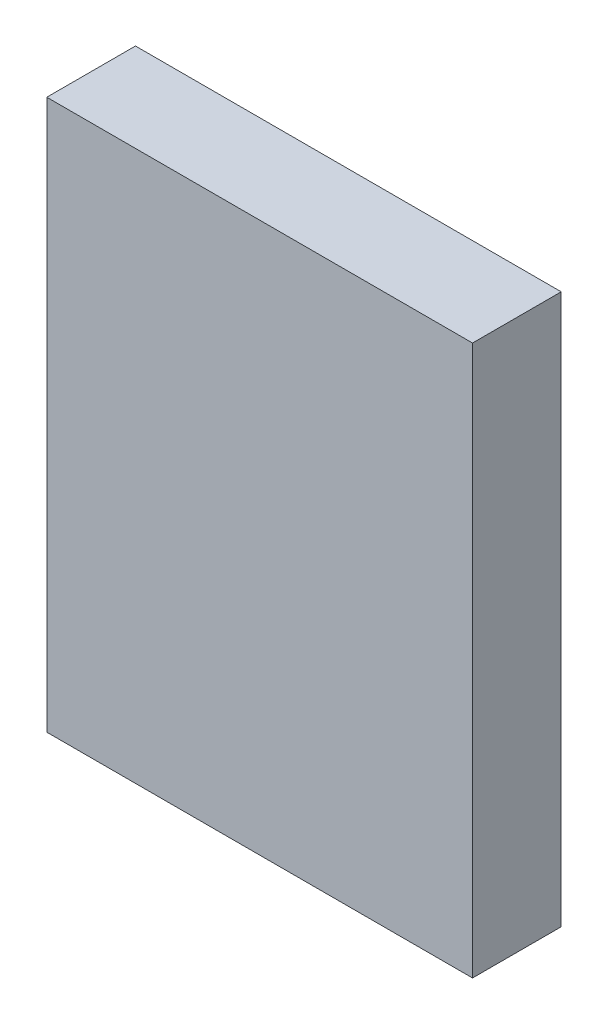
ISO-10303-21;
HEADER;
FILE_DESCRIPTION(('STEP AP214'),'2;1');
FILE_NAME('part.step','',(''),(''),'','','');
FILE_SCHEMA(('AUTOMOTIVE_DESIGN { 1 0 10303 214 1 1 1 1 }'));
ENDSEC;
DATA;
#1=APPLICATION_CONTEXT('core data for automotive mechanical design processes');
#2=APPLICATION_PROTOCOL_DEFINITION('international standard','automotive_design',2000,#1);
#3=PRODUCT_CONTEXT('',#1,'mechanical');
#4=PRODUCT('Part','Part','',(#3));
#5=PRODUCT_RELATED_PRODUCT_CATEGORY('part','',(#4));
#6=PRODUCT_DEFINITION_FORMATION('','',#4);
#7=PRODUCT_DEFINITION_CONTEXT('part definition',#1,'design');
#8=PRODUCT_DEFINITION('design','',#6,#7);
#9=PRODUCT_DEFINITION_SHAPE('','',#8);
#10=(LENGTH_UNIT() NAMED_UNIT(*) SI_UNIT(.MILLI.,.METRE.));
#11=(NAMED_UNIT(*) PLANE_ANGLE_UNIT() SI_UNIT($,.RADIAN.));
#12=(NAMED_UNIT(*) SI_UNIT($,.STERADIAN.) SOLID_ANGLE_UNIT());
#13=UNCERTAINTY_MEASURE_WITH_UNIT(LENGTH_MEASURE(1.E-05),#10,'distance_accuracy_value','');
#14=(GEOMETRIC_REPRESENTATION_CONTEXT(3) GLOBAL_UNCERTAINTY_ASSIGNED_CONTEXT((#13)) GLOBAL_UNIT_ASSIGNED_CONTEXT((#10,
#11,#12)) REPRESENTATION_CONTEXT('',''));
#15=CARTESIAN_POINT('',(0.,0.,0.));
#16=DIRECTION('',(0.,0.,1.));
#17=DIRECTION('',(1.,0.,0.));
#18=AXIS2_PLACEMENT_3D('',#15,#16,#17);
#19=CARTESIAN_POINT('',(-1.20000014,1.54999944,0.499999));
#20=DIRECTION('',(0.,0.,-1.));
#21=DIRECTION('',(-1.,0.,0.));
#22=AXIS2_PLACEMENT_3D('',#19,#20,#21);
#23=PLANE('',#22);
#24=DIRECTION('',(0.,1.,0.));
#25=VECTOR('',#24,1.);
#26=CARTESIAN_POINT('',(1.20000014,-1.54999944,0.499999));
#27=LINE('',#26,#25);
#28=CARTESIAN_POINT('',(1.20000014,-1.54999944,0.499999));
#29=VERTEX_POINT('',#28);
#30=CARTESIAN_POINT('',(1.20000014,1.54999944,0.499999));
#31=VERTEX_POINT('',#30);
#32=EDGE_CURVE('E80',#29,#31,#27,.T.);
#33=ORIENTED_EDGE('',*,*,#32,.T.);
#34=DIRECTION('',(1.,0.,0.));
#35=VECTOR('',#34,1.);
#36=CARTESIAN_POINT('',(1.20000014,1.54999944,0.499999));
#37=LINE('',#36,#35);
#38=CARTESIAN_POINT('',(-1.20000014,1.54999944,0.499999));
#39=VERTEX_POINT('',#38);
#40=EDGE_CURVE('E55',#31,#39,#37,.F.);
#41=ORIENTED_EDGE('',*,*,#40,.T.);
#42=DIRECTION('',(0.,1.,0.));
#43=VECTOR('',#42,1.);
#44=CARTESIAN_POINT('',(-1.20000014,1.54999944,0.499999));
#45=LINE('',#44,#43);
#46=CARTESIAN_POINT('',(-1.20000014,-1.54999944,0.499999));
#47=VERTEX_POINT('',#46);
#48=EDGE_CURVE('E57',#39,#47,#45,.F.);
#49=ORIENTED_EDGE('',*,*,#48,.T.);
#50=DIRECTION('',(1.,0.,0.));
#51=VECTOR('',#50,1.);
#52=CARTESIAN_POINT('',(-1.20000014,-1.54999944,0.499999));
#53=LINE('',#52,#51);
#54=EDGE_CURVE('E20',#47,#29,#53,.T.);
#55=ORIENTED_EDGE('',*,*,#54,.T.);
#56=EDGE_LOOP('',(#33,#41,#49,#55));
#57=FACE_BOUND('',#56,.T.);
#58=ADVANCED_FACE('F17',(#57),#23,.F.);
#59=CARTESIAN_POINT('',(-1.20000014,-1.54999944,0.));
#60=DIRECTION('',(0.,1.,0.));
#61=DIRECTION('',(0.,0.,1.));
#62=AXIS2_PLACEMENT_3D('',#59,#60,#61);
#63=PLANE('',#62);
#64=ORIENTED_EDGE('',*,*,#54,.F.);
#65=DIRECTION('',(0.,0.,-1.));
#66=VECTOR('',#65,1.);
#67=CARTESIAN_POINT('',(-1.20000014,-1.54999944,0.));
#68=LINE('',#67,#66);
#69=CARTESIAN_POINT('',(-1.20000014,-1.54999944,0.));
#70=VERTEX_POINT('',#69);
#71=EDGE_CURVE('E63',#47,#70,#68,.T.);
#72=ORIENTED_EDGE('',*,*,#71,.T.);
#73=DIRECTION('',(-1.,0.,0.));
#74=VECTOR('',#73,1.);
#75=CARTESIAN_POINT('',(-1.20000014,-1.54999944,0.));
#76=LINE('',#75,#74);
#77=CARTESIAN_POINT('',(1.20000014,-1.54999944,0.));
#78=VERTEX_POINT('',#77);
#79=EDGE_CURVE('E83',#78,#70,#76,.T.);
#80=ORIENTED_EDGE('',*,*,#79,.F.);
#81=DIRECTION('',(0.,0.,1.));
#82=VECTOR('',#81,1.);
#83=CARTESIAN_POINT('',(1.20000014,-1.54999944,0.));
#84=LINE('',#83,#82);
#85=EDGE_CURVE('E68',#78,#29,#84,.T.);
#86=ORIENTED_EDGE('',*,*,#85,.T.);
#87=EDGE_LOOP('',(#64,#72,#80,#86));
#88=FACE_BOUND('',#87,.T.);
#89=ADVANCED_FACE('F65',(#88),#63,.F.);
#90=CARTESIAN_POINT('',(-1.20000014,1.54999944,0.));
#91=DIRECTION('',(1.,0.,0.));
#92=DIRECTION('',(0.,0.,-1.));
#93=AXIS2_PLACEMENT_3D('',#90,#91,#92);
#94=PLANE('',#93);
#95=ORIENTED_EDGE('',*,*,#48,.F.);
#96=DIRECTION('',(0.,0.,-1.));
#97=VECTOR('',#96,1.);
#98=CARTESIAN_POINT('',(-1.20000014,1.54999944,0.));
#99=LINE('',#98,#97);
#100=CARTESIAN_POINT('',(-1.20000014,1.54999944,0.));
#101=VERTEX_POINT('',#100);
#102=EDGE_CURVE('E75',#39,#101,#99,.T.);
#103=ORIENTED_EDGE('',*,*,#102,.T.);
#104=DIRECTION('',(0.,1.,0.));
#105=VECTOR('',#104,1.);
#106=CARTESIAN_POINT('',(-1.20000014,1.54999944,0.));
#107=LINE('',#106,#105);
#108=EDGE_CURVE('E72',#70,#101,#107,.T.);
#109=ORIENTED_EDGE('',*,*,#108,.F.);
#110=ORIENTED_EDGE('',*,*,#71,.F.);
#111=EDGE_LOOP('',(#95,#103,#109,#110));
#112=FACE_BOUND('',#111,.T.);
#113=ADVANCED_FACE('F70',(#112),#94,.F.);
#114=CARTESIAN_POINT('',(1.20000014,1.54999944,0.));
#115=DIRECTION('',(0.,-1.,0.));
#116=DIRECTION('',(0.,0.,-1.));
#117=AXIS2_PLACEMENT_3D('',#114,#115,#116);
#118=PLANE('',#117);
#119=ORIENTED_EDGE('',*,*,#40,.F.);
#120=DIRECTION('',(0.,0.,1.));
#121=VECTOR('',#120,1.);
#122=CARTESIAN_POINT('',(1.20000014,1.54999944,0.));
#123=LINE('',#122,#121);
#124=CARTESIAN_POINT('',(1.20000014,1.54999944,0.));
#125=VERTEX_POINT('',#124);
#126=EDGE_CURVE('E35',#31,#125,#123,.F.);
#127=ORIENTED_EDGE('',*,*,#126,.T.);
#128=DIRECTION('',(-1.,0.,0.));
#129=VECTOR('',#128,1.);
#130=CARTESIAN_POINT('',(-1.20000014,1.54999944,0.));
#131=LINE('',#130,#129);
#132=EDGE_CURVE('E26',#101,#125,#131,.F.);
#133=ORIENTED_EDGE('',*,*,#132,.F.);
#134=ORIENTED_EDGE('',*,*,#102,.F.);
#135=EDGE_LOOP('',(#119,#127,#133,#134));
#136=FACE_BOUND('',#135,.T.);
#137=ADVANCED_FACE('F89',(#136),#118,.F.);
#138=CARTESIAN_POINT('',(1.20000014,-1.54999944,0.));
#139=DIRECTION('',(-1.,0.,0.));
#140=DIRECTION('',(0.,0.,1.));
#141=AXIS2_PLACEMENT_3D('',#138,#139,#140);
#142=PLANE('',#141);
#143=ORIENTED_EDGE('',*,*,#32,.F.);
#144=ORIENTED_EDGE('',*,*,#85,.F.);
#145=DIRECTION('',(0.,1.,0.));
#146=VECTOR('',#145,1.);
#147=CARTESIAN_POINT('',(1.20000014,1.54999944,0.));
#148=LINE('',#147,#146);
#149=EDGE_CURVE('E11',#125,#78,#148,.F.);
#150=ORIENTED_EDGE('',*,*,#149,.F.);
#151=ORIENTED_EDGE('',*,*,#126,.F.);
#152=EDGE_LOOP('',(#143,#144,#150,#151));
#153=FACE_BOUND('',#152,.T.);
#154=ADVANCED_FACE('F91',(#153),#142,.F.);
#155=CARTESIAN_POINT('',(-1.20000014,1.54999944,0.));
#156=DIRECTION('',(0.,0.,-1.));
#157=DIRECTION('',(-1.,0.,0.));
#158=AXIS2_PLACEMENT_3D('',#155,#156,#157);
#159=PLANE('',#158);
#160=ORIENTED_EDGE('',*,*,#132,.T.);
#161=ORIENTED_EDGE('',*,*,#149,.T.);
#162=ORIENTED_EDGE('',*,*,#79,.T.);
#163=ORIENTED_EDGE('',*,*,#108,.T.);
#164=EDGE_LOOP('',(#160,#161,#162,#163));
#165=FACE_BOUND('',#164,.T.);
#166=ADVANCED_FACE('F88',(#165),#159,.T.);
#167=CLOSED_SHELL('',(#58,#89,#113,#137,#154,#166));
#168=MANIFOLD_SOLID_BREP('B1',#167);
#169=ADVANCED_BREP_SHAPE_REPRESENTATION('',(#18,#168),#14);
#170=SHAPE_DEFINITION_REPRESENTATION(#9,#169);
ENDSEC;
END-ISO-10303-21;
